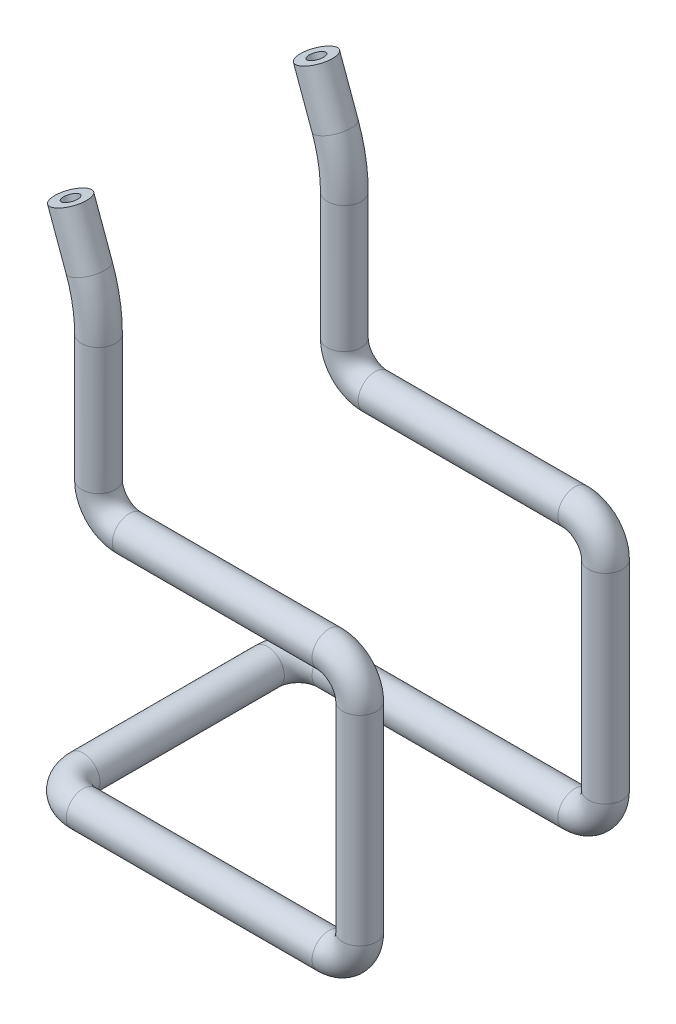
ISO-10303-21;
HEADER;
FILE_DESCRIPTION(('STEP AP214'),'2;1');
FILE_NAME('part.step','',(''),(''),'','','');
FILE_SCHEMA(('AUTOMOTIVE_DESIGN { 1 0 10303 214 1 1 1 1 }'));
ENDSEC;
DATA;
#1=APPLICATION_CONTEXT('core data for automotive mechanical design processes');
#2=APPLICATION_PROTOCOL_DEFINITION('international standard','automotive_design',2000,#1);
#3=PRODUCT_CONTEXT('',#1,'mechanical');
#4=PRODUCT('Part','Part','',(#3));
#5=PRODUCT_RELATED_PRODUCT_CATEGORY('part','',(#4));
#6=PRODUCT_DEFINITION_FORMATION('','',#4);
#7=PRODUCT_DEFINITION_CONTEXT('part definition',#1,'design');
#8=PRODUCT_DEFINITION('design','',#6,#7);
#9=PRODUCT_DEFINITION_SHAPE('','',#8);
#10=(LENGTH_UNIT() NAMED_UNIT(*) SI_UNIT(.MILLI.,.METRE.));
#11=(NAMED_UNIT(*) PLANE_ANGLE_UNIT() SI_UNIT($,.RADIAN.));
#12=(NAMED_UNIT(*) SI_UNIT($,.STERADIAN.) SOLID_ANGLE_UNIT());
#13=UNCERTAINTY_MEASURE_WITH_UNIT(LENGTH_MEASURE(1.E-05),#10,'distance_accuracy_value','');
#14=(GEOMETRIC_REPRESENTATION_CONTEXT(3) GLOBAL_UNCERTAINTY_ASSIGNED_CONTEXT((#13)) GLOBAL_UNIT_ASSIGNED_CONTEXT((#10,
#11,#12)) REPRESENTATION_CONTEXT('',''));
#15=CARTESIAN_POINT('',(0.,0.,0.));
#16=DIRECTION('',(0.,0.,1.));
#17=DIRECTION('',(1.,0.,0.));
#18=AXIS2_PLACEMENT_3D('',#15,#16,#17);
#19=CARTESIAN_POINT('',(5.93646620186974,169.896316525798,-40.));
#20=DIRECTION('',(0.34202014332567,-0.939692620785908,0.));
#21=DIRECTION('',(0.939692620785908,0.34202014332567,0.));
#22=AXIS2_PLACEMENT_3D('',#19,#20,#21);
#23=PLANE('',#22);
#24=CARTESIAN_POINT('',(5.93646620186974,169.896316525798,-40.));
#25=DIRECTION('',(0.34202014332567,-0.939692620785908,0.));
#26=DIRECTION('',(0.939692620785908,0.34202014332567,0.));
#27=AXIS2_PLACEMENT_3D('',#24,#25,#26);
#28=CIRCLE('',#27,2.5);
#29=CARTESIAN_POINT('',(8.28569775383451,170.751366884112,-40.));
#30=VERTEX_POINT('',#29);
#31=EDGE_CURVE('E96',#30,#30,#28,.T.);
#32=ORIENTED_EDGE('',*,*,#31,.T.);
#33=EDGE_LOOP('',(#32));
#34=FACE_BOUND('',#33,.T.);
#35=CARTESIAN_POINT('',(5.93646620186975,169.896316525798,-40.));
#36=DIRECTION('',(0.34202014332567,-0.939692620785908,0.));
#37=DIRECTION('',(0.939692620785908,0.34202014332567,0.));
#38=AXIS2_PLACEMENT_3D('',#35,#36,#37);
#39=CIRCLE('',#38,5.5);
#40=CARTESIAN_POINT('',(11.1047756161922,171.777427314089,-40.));
#41=VERTEX_POINT('',#40);
#42=EDGE_CURVE('E11',#41,#41,#39,.T.);
#43=ORIENTED_EDGE('',*,*,#42,.F.);
#44=EDGE_LOOP('',(#43));
#45=FACE_BOUND('',#44,.T.);
#46=ADVANCED_FACE('F55',(#34,#45),#23,.F.);
#47=CARTESIAN_POINT('',(0.,0.,0.));
#48=DIRECTION('',(0.,0.,-1.));
#49=DIRECTION('',(-1.,0.,0.));
#50=AXIS2_PLACEMENT_3D('',#47,#48,#49);
#51=CYLINDRICAL_SURFACE('',#50,5.5);
#52=CARTESIAN_POINT('',(0.,0.,-30.));
#53=DIRECTION('',(0.,0.,-1.));
#54=DIRECTION('',(-1.,0.,0.));
#55=AXIS2_PLACEMENT_3D('',#52,#53,#54);
#56=CIRCLE('',#55,5.5);
#57=CARTESIAN_POINT('',(-5.5,0.,-30.));
#58=VERTEX_POINT('',#57);
#59=EDGE_CURVE('E93',#58,#58,#56,.F.);
#60=ORIENTED_EDGE('',*,*,#59,.T.);
#61=EDGE_LOOP('',(#60));
#62=FACE_BOUND('',#61,.T.);
#63=CARTESIAN_POINT('',(0.,0.,30.));
#64=DIRECTION('',(0.,0.,1.));
#65=DIRECTION('',(1.,0.,0.));
#66=AXIS2_PLACEMENT_3D('',#63,#64,#65);
#67=CIRCLE('',#66,5.5);
#68=CARTESIAN_POINT('',(-5.5,0.,30.));
#69=VERTEX_POINT('',#68);
#70=EDGE_CURVE('E159',#69,#69,#67,.F.);
#71=ORIENTED_EDGE('',*,*,#70,.T.);
#72=EDGE_LOOP('',(#71));
#73=FACE_BOUND('',#72,.T.);
#74=ADVANCED_FACE('F428',(#62,#73),#51,.T.);
#75=CARTESIAN_POINT('',(10.,0.,-30.));
#76=DIRECTION('',(0.,-1.,0.));
#77=DIRECTION('',(1.,0.,0.));
#78=AXIS2_PLACEMENT_3D('',#75,#76,#77);
#79=TOROIDAL_SURFACE('',#78,10.,5.5);
#80=CARTESIAN_POINT('',(10.0000000000001,0.,-40.));
#81=DIRECTION('',(-1.,0.,0.));
#82=DIRECTION('',(0.,0.,1.));
#83=AXIS2_PLACEMENT_3D('',#80,#81,#82);
#84=CIRCLE('',#83,5.5);
#85=CARTESIAN_POINT('',(10.0000000000001,0.,-45.5));
#86=VERTEX_POINT('',#85);
#87=EDGE_CURVE('E90',#86,#86,#84,.T.);
#88=CARTESIAN_POINT('',(10.,0.,-30.));
#89=DIRECTION('',(0.,-1.,0.));
#90=DIRECTION('',(1.,0.,0.));
#91=AXIS2_PLACEMENT_3D('',#88,#89,#90);
#92=CIRCLE('',#91,15.5);
#93=EDGE_CURVE('',#58,#86,#92,.T.);
#94=ORIENTED_EDGE('',*,*,#59,.F.);
#95=ORIENTED_EDGE('',*,*,#87,.T.);
#96=ORIENTED_EDGE('',*,*,#93,.T.);
#97=ORIENTED_EDGE('',*,*,#93,.F.);
#98=EDGE_LOOP('',(#94,#96,#95,#97));
#99=FACE_BOUND('',#98,.T.);
#100=ADVANCED_FACE('F434',(#99),#79,.T.);
#101=CARTESIAN_POINT('',(10.0000000000001,0.,-40.));
#102=DIRECTION('',(1.,0.,0.));
#103=DIRECTION('',(0.,1.,0.));
#104=AXIS2_PLACEMENT_3D('',#101,#102,#103);
#105=CYLINDRICAL_SURFACE('',#104,5.5);
#106=CARTESIAN_POINT('',(90.0000000000001,0.,-40.));
#107=DIRECTION('',(1.,0.,0.));
#108=DIRECTION('',(0.,1.,0.));
#109=AXIS2_PLACEMENT_3D('',#106,#107,#108);
#110=CIRCLE('',#109,5.5);
#111=CARTESIAN_POINT('',(90.0000000000001,-5.50000000000003,-40.));
#112=VERTEX_POINT('',#111);
#113=EDGE_CURVE('E87',#112,#112,#110,.F.);
#114=ORIENTED_EDGE('',*,*,#113,.T.);
#115=EDGE_LOOP('',(#114));
#116=FACE_BOUND('',#115,.T.);
#117=ORIENTED_EDGE('',*,*,#87,.F.);
#118=EDGE_LOOP('',(#117));
#119=FACE_BOUND('',#118,.T.);
#120=ADVANCED_FACE('F593',(#116,#119),#105,.T.);
#121=CARTESIAN_POINT('',(90.,9.99999999999996,-40.));
#122=DIRECTION('',(0.,0.,1.));
#123=DIRECTION('',(1.,0.,0.));
#124=AXIS2_PLACEMENT_3D('',#121,#122,#123);
#125=TOROIDAL_SURFACE('',#124,9.99999999999999,5.5);
#126=CARTESIAN_POINT('',(100.,9.99999999999999,-40.));
#127=DIRECTION('',(0.,-1.,0.));
#128=DIRECTION('',(1.,0.,0.));
#129=AXIS2_PLACEMENT_3D('',#126,#127,#128);
#130=CIRCLE('',#129,5.5);
#131=CARTESIAN_POINT('',(105.5,10.,-40.));
#132=VERTEX_POINT('',#131);
#133=EDGE_CURVE('E84',#132,#132,#130,.T.);
#134=CARTESIAN_POINT('',(90.,9.99999999999996,-40.));
#135=DIRECTION('',(0.,0.,1.));
#136=DIRECTION('',(1.,0.,0.));
#137=AXIS2_PLACEMENT_3D('',#134,#135,#136);
#138=CIRCLE('',#137,15.5);
#139=EDGE_CURVE('',#112,#132,#138,.T.);
#140=ORIENTED_EDGE('',*,*,#113,.F.);
#141=ORIENTED_EDGE('',*,*,#133,.T.);
#142=ORIENTED_EDGE('',*,*,#139,.T.);
#143=ORIENTED_EDGE('',*,*,#139,.F.);
#144=EDGE_LOOP('',(#140,#142,#141,#143));
#145=FACE_BOUND('',#144,.T.);
#146=ADVANCED_FACE('F583',(#145),#125,.T.);
#147=CARTESIAN_POINT('',(100.,9.99999999999998,-40.));
#148=DIRECTION('',(0.,1.,0.));
#149=DIRECTION('',(0.,0.,1.));
#150=AXIS2_PLACEMENT_3D('',#147,#148,#149);
#151=CYLINDRICAL_SURFACE('',#150,5.5);
#152=CARTESIAN_POINT('',(100.,75.,-40.));
#153=DIRECTION('',(0.,1.,0.));
#154=DIRECTION('',(0.,0.,1.));
#155=AXIS2_PLACEMENT_3D('',#152,#153,#154);
#156=CIRCLE('',#155,5.5);
#157=CARTESIAN_POINT('',(105.5,75.,-40.));
#158=VERTEX_POINT('',#157);
#159=EDGE_CURVE('E81',#158,#158,#156,.F.);
#160=ORIENTED_EDGE('',*,*,#159,.T.);
#161=EDGE_LOOP('',(#160));
#162=FACE_BOUND('',#161,.T.);
#163=ORIENTED_EDGE('',*,*,#133,.F.);
#164=EDGE_LOOP('',(#163));
#165=FACE_BOUND('',#164,.T.);
#166=ADVANCED_FACE('F573',(#162,#165),#151,.T.);
#167=CARTESIAN_POINT('',(90.,75.,-40.));
#168=DIRECTION('',(0.,0.,1.));
#169=DIRECTION('',(1.,0.,0.));
#170=AXIS2_PLACEMENT_3D('',#167,#168,#169);
#171=TOROIDAL_SURFACE('',#170,9.99999999999998,5.5);
#172=CARTESIAN_POINT('',(90.,85.,-40.));
#173=DIRECTION('',(1.,0.,0.));
#174=DIRECTION('',(0.,1.,0.));
#175=AXIS2_PLACEMENT_3D('',#172,#173,#174);
#176=CIRCLE('',#175,5.5);
#177=CARTESIAN_POINT('',(89.9999999999999,90.5,-40.));
#178=VERTEX_POINT('',#177);
#179=EDGE_CURVE('E78',#178,#178,#176,.T.);
#180=CARTESIAN_POINT('',(90.,75.,-40.));
#181=DIRECTION('',(0.,0.,1.));
#182=DIRECTION('',(1.,0.,0.));
#183=AXIS2_PLACEMENT_3D('',#180,#181,#182);
#184=CIRCLE('',#183,15.5);
#185=EDGE_CURVE('',#158,#178,#184,.T.);
#186=ORIENTED_EDGE('',*,*,#159,.F.);
#187=ORIENTED_EDGE('',*,*,#179,.T.);
#188=ORIENTED_EDGE('',*,*,#185,.T.);
#189=ORIENTED_EDGE('',*,*,#185,.F.);
#190=EDGE_LOOP('',(#186,#188,#187,#189));
#191=FACE_BOUND('',#190,.T.);
#192=ADVANCED_FACE('F563',(#191),#171,.T.);
#193=CARTESIAN_POINT('',(90.,85.,-40.));
#194=DIRECTION('',(-1.,0.,0.));
#195=DIRECTION('',(0.,0.,1.));
#196=AXIS2_PLACEMENT_3D('',#193,#194,#195);
#197=CYLINDRICAL_SURFACE('',#196,5.5);
#198=CARTESIAN_POINT('',(25.,85.,-40.));
#199=DIRECTION('',(-1.,0.,0.));
#200=DIRECTION('',(0.,0.,1.));
#201=AXIS2_PLACEMENT_3D('',#198,#199,#200);
#202=CIRCLE('',#201,5.5);
#203=CARTESIAN_POINT('',(25.,79.4999999999999,-40.));
#204=VERTEX_POINT('',#203);
#205=EDGE_CURVE('E75',#204,#204,#202,.F.);
#206=ORIENTED_EDGE('',*,*,#205,.T.);
#207=EDGE_LOOP('',(#206));
#208=FACE_BOUND('',#207,.T.);
#209=ORIENTED_EDGE('',*,*,#179,.F.);
#210=EDGE_LOOP('',(#209));
#211=FACE_BOUND('',#210,.T.);
#212=ADVANCED_FACE('F553',(#208,#211),#197,.T.);
#213=CARTESIAN_POINT('',(25.,95.,-40.));
#214=DIRECTION('',(0.,0.,-1.));
#215=DIRECTION('',(-1.,0.,0.));
#216=AXIS2_PLACEMENT_3D('',#213,#214,#215);
#217=TOROIDAL_SURFACE('',#216,10.,5.5);
#218=CARTESIAN_POINT('',(15.,95.,-40.));
#219=DIRECTION('',(0.,-1.,0.));
#220=DIRECTION('',(1.,0.,0.));
#221=AXIS2_PLACEMENT_3D('',#218,#219,#220);
#222=CIRCLE('',#221,5.5);
#223=CARTESIAN_POINT('',(9.49999999999998,95.,-40.));
#224=VERTEX_POINT('',#223);
#225=EDGE_CURVE('E70',#224,#224,#222,.T.);
#226=CARTESIAN_POINT('',(25.,95.,-40.));
#227=DIRECTION('',(0.,0.,-1.));
#228=DIRECTION('',(-1.,0.,0.));
#229=AXIS2_PLACEMENT_3D('',#226,#227,#228);
#230=CIRCLE('',#229,15.5);
#231=EDGE_CURVE('',#204,#224,#230,.T.);
#232=ORIENTED_EDGE('',*,*,#205,.F.);
#233=ORIENTED_EDGE('',*,*,#225,.T.);
#234=ORIENTED_EDGE('',*,*,#231,.T.);
#235=ORIENTED_EDGE('',*,*,#231,.F.);
#236=EDGE_LOOP('',(#232,#234,#233,#235));
#237=FACE_BOUND('',#236,.T.);
#238=ADVANCED_FACE('F543',(#237),#217,.T.);
#239=CARTESIAN_POINT('',(15.,95.,-40.));
#240=DIRECTION('',(0.,1.,0.));
#241=DIRECTION('',(-1.,0.,0.));
#242=AXIS2_PLACEMENT_3D('',#239,#240,#241);
#243=CYLINDRICAL_SURFACE('',#242,5.5);
#244=CARTESIAN_POINT('',(15.,136.178113039548,-40.));
#245=DIRECTION('',(0.,1.,0.));
#246=DIRECTION('',(-1.,0.,0.));
#247=AXIS2_PLACEMENT_3D('',#244,#245,#246);
#248=CIRCLE('',#247,5.5);
#249=CARTESIAN_POINT('',(20.5,136.178113039548,-40.));
#250=VERTEX_POINT('',#249);
#251=EDGE_CURVE('E66',#250,#250,#248,.F.);
#252=ORIENTED_EDGE('',*,*,#251,.T.);
#253=EDGE_LOOP('',(#252));
#254=FACE_BOUND('',#253,.T.);
#255=ORIENTED_EDGE('',*,*,#225,.F.);
#256=EDGE_LOOP('',(#255));
#257=FACE_BOUND('',#256,.T.);
#258=ADVANCED_FACE('F535',(#254,#257),#243,.T.);
#259=CARTESIAN_POINT('',(-35.,136.178113039548,-40.));
#260=DIRECTION('',(0.,0.,1.));
#261=DIRECTION('',(1.,0.,0.));
#262=AXIS2_PLACEMENT_3D('',#259,#260,#261);
#263=TOROIDAL_SURFACE('',#262,50.,5.5);
#264=CARTESIAN_POINT('',(11.9846310392954,153.279120205831,-40.));
#265=DIRECTION('',(0.342020143325671,-0.939692620785908,0.));
#266=DIRECTION('',(0.939692620785908,0.342020143325671,0.));
#267=AXIS2_PLACEMENT_3D('',#264,#265,#266);
#268=CIRCLE('',#267,5.5);
#269=CARTESIAN_POINT('',(17.1529404536179,155.160230994123,-40.));
#270=VERTEX_POINT('',#269);
#271=EDGE_CURVE('E62',#270,#270,#268,.T.);
#272=CARTESIAN_POINT('',(-35.,136.178113039548,-40.));
#273=DIRECTION('',(0.,0.,1.));
#274=DIRECTION('',(1.,0.,0.));
#275=AXIS2_PLACEMENT_3D('',#272,#273,#274);
#276=CIRCLE('',#275,55.5);
#277=EDGE_CURVE('',#250,#270,#276,.T.);
#278=ORIENTED_EDGE('',*,*,#251,.F.);
#279=ORIENTED_EDGE('',*,*,#271,.T.);
#280=ORIENTED_EDGE('',*,*,#277,.T.);
#281=ORIENTED_EDGE('',*,*,#277,.F.);
#282=EDGE_LOOP('',(#278,#280,#279,#281));
#283=FACE_BOUND('',#282,.T.);
#284=ADVANCED_FACE('F211',(#283),#263,.T.);
#285=CARTESIAN_POINT('',(11.9846310392954,153.279120205831,-40.));
#286=DIRECTION('',(-0.34202014332567,0.939692620785908,0.));
#287=DIRECTION('',(-0.939692620785908,-0.34202014332567,0.));
#288=AXIS2_PLACEMENT_3D('',#285,#286,#287);
#289=CYLINDRICAL_SURFACE('',#288,5.5);
#290=ORIENTED_EDGE('',*,*,#42,.T.);
#291=EDGE_LOOP('',(#290));
#292=FACE_BOUND('',#291,.T.);
#293=ORIENTED_EDGE('',*,*,#271,.F.);
#294=EDGE_LOOP('',(#293));
#295=FACE_BOUND('',#294,.T.);
#296=ADVANCED_FACE('F57',(#292,#295),#289,.T.);
#297=CARTESIAN_POINT('',(0.,0.,0.));
#298=DIRECTION('',(0.,0.,-1.));
#299=DIRECTION('',(-1.,0.,0.));
#300=AXIS2_PLACEMENT_3D('',#297,#298,#299);
#301=CYLINDRICAL_SURFACE('',#300,2.5);
#302=CARTESIAN_POINT('',(0.,0.,-30.));
#303=DIRECTION('',(0.,0.,1.));
#304=DIRECTION('',(0.,-1.,0.));
#305=AXIS2_PLACEMENT_3D('',#302,#303,#304);
#306=CIRCLE('',#305,2.5);
#307=CARTESIAN_POINT('',(-2.5,0.,-30.));
#308=VERTEX_POINT('',#307);
#309=EDGE_CURVE('E126',#308,#308,#306,.T.);
#310=ORIENTED_EDGE('',*,*,#309,.F.);
#311=EDGE_LOOP('',(#310));
#312=FACE_BOUND('',#311,.T.);
#313=CARTESIAN_POINT('',(0.,0.,30.));
#314=DIRECTION('',(0.,0.,1.));
#315=DIRECTION('',(0.,-1.,0.));
#316=AXIS2_PLACEMENT_3D('',#313,#314,#315);
#317=CIRCLE('',#316,2.5);
#318=CARTESIAN_POINT('',(-2.5,0.,30.));
#319=VERTEX_POINT('',#318);
#320=EDGE_CURVE('E192',#319,#319,#317,.F.);
#321=ORIENTED_EDGE('',*,*,#320,.F.);
#322=EDGE_LOOP('',(#321));
#323=FACE_BOUND('',#322,.T.);
#324=ADVANCED_FACE('F198',(#312,#323),#301,.F.);
#325=CARTESIAN_POINT('',(10.,0.,-30.));
#326=DIRECTION('',(0.,-1.,0.));
#327=DIRECTION('',(1.,0.,0.));
#328=AXIS2_PLACEMENT_3D('',#325,#326,#327);
#329=TOROIDAL_SURFACE('',#328,10.,2.5);
#330=CARTESIAN_POINT('',(10.0000000000001,0.,-40.));
#331=DIRECTION('',(-1.,0.,0.));
#332=DIRECTION('',(0.,-1.,0.));
#333=AXIS2_PLACEMENT_3D('',#330,#331,#332);
#334=CIRCLE('',#333,2.5);
#335=CARTESIAN_POINT('',(10.0000000000001,0.,-42.5));
#336=VERTEX_POINT('',#335);
#337=EDGE_CURVE('E123',#336,#336,#334,.T.);
#338=CARTESIAN_POINT('',(10.,0.,-30.));
#339=DIRECTION('',(0.,-1.,0.));
#340=DIRECTION('',(1.,0.,0.));
#341=AXIS2_PLACEMENT_3D('',#338,#339,#340);
#342=CIRCLE('',#341,12.5);
#343=EDGE_CURVE('',#308,#336,#342,.T.);
#344=ORIENTED_EDGE('',*,*,#309,.T.);
#345=ORIENTED_EDGE('',*,*,#337,.F.);
#346=ORIENTED_EDGE('',*,*,#343,.T.);
#347=ORIENTED_EDGE('',*,*,#343,.F.);
#348=EDGE_LOOP('',(#344,#346,#345,#347));
#349=FACE_BOUND('',#348,.T.);
#350=ADVANCED_FACE('F200',(#349),#329,.F.);
#351=CARTESIAN_POINT('',(10.0000000000001,0.,-40.));
#352=DIRECTION('',(1.,0.,0.));
#353=DIRECTION('',(0.,1.,0.));
#354=AXIS2_PLACEMENT_3D('',#351,#352,#353);
#355=CYLINDRICAL_SURFACE('',#354,2.5);
#356=CARTESIAN_POINT('',(90.0000000000001,0.,-40.));
#357=DIRECTION('',(-1.,0.,0.));
#358=DIRECTION('',(0.,-1.,0.));
#359=AXIS2_PLACEMENT_3D('',#356,#357,#358);
#360=CIRCLE('',#359,2.5);
#361=CARTESIAN_POINT('',(90.0000000000001,-2.50000000000003,-40.));
#362=VERTEX_POINT('',#361);
#363=EDGE_CURVE('E120',#362,#362,#360,.T.);
#364=ORIENTED_EDGE('',*,*,#363,.F.);
#365=EDGE_LOOP('',(#364));
#366=FACE_BOUND('',#365,.T.);
#367=ORIENTED_EDGE('',*,*,#337,.T.);
#368=EDGE_LOOP('',(#367));
#369=FACE_BOUND('',#368,.T.);
#370=ADVANCED_FACE('F208',(#366,#369),#355,.F.);
#371=CARTESIAN_POINT('',(90.,9.99999999999996,-40.));
#372=DIRECTION('',(0.,0.,1.));
#373=DIRECTION('',(1.,0.,0.));
#374=AXIS2_PLACEMENT_3D('',#371,#372,#373);
#375=TOROIDAL_SURFACE('',#374,9.99999999999999,2.5);
#376=CARTESIAN_POINT('',(100.,9.99999999999998,-40.));
#377=DIRECTION('',(0.,-1.,0.));
#378=DIRECTION('',(1.,0.,0.));
#379=AXIS2_PLACEMENT_3D('',#376,#377,#378);
#380=CIRCLE('',#379,2.5);
#381=CARTESIAN_POINT('',(102.5,9.99999999999999,-40.));
#382=VERTEX_POINT('',#381);
#383=EDGE_CURVE('E117',#382,#382,#380,.T.);
#384=CARTESIAN_POINT('',(90.,9.99999999999996,-40.));
#385=DIRECTION('',(0.,0.,1.));
#386=DIRECTION('',(1.,0.,0.));
#387=AXIS2_PLACEMENT_3D('',#384,#385,#386);
#388=CIRCLE('',#387,12.5);
#389=EDGE_CURVE('',#362,#382,#388,.T.);
#390=ORIENTED_EDGE('',*,*,#363,.T.);
#391=ORIENTED_EDGE('',*,*,#383,.F.);
#392=ORIENTED_EDGE('',*,*,#389,.T.);
#393=ORIENTED_EDGE('',*,*,#389,.F.);
#394=EDGE_LOOP('',(#390,#392,#391,#393));
#395=FACE_BOUND('',#394,.T.);
#396=ADVANCED_FACE('F501',(#395),#375,.F.);
#397=CARTESIAN_POINT('',(100.,9.99999999999998,-40.));
#398=DIRECTION('',(0.,1.,0.));
#399=DIRECTION('',(0.,0.,1.));
#400=AXIS2_PLACEMENT_3D('',#397,#398,#399);
#401=CYLINDRICAL_SURFACE('',#400,2.5);
#402=CARTESIAN_POINT('',(100.,75.,-40.));
#403=DIRECTION('',(0.,-1.,0.));
#404=DIRECTION('',(1.,0.,0.));
#405=AXIS2_PLACEMENT_3D('',#402,#403,#404);
#406=CIRCLE('',#405,2.5);
#407=CARTESIAN_POINT('',(102.5,75.,-40.));
#408=VERTEX_POINT('',#407);
#409=EDGE_CURVE('E114',#408,#408,#406,.T.);
#410=ORIENTED_EDGE('',*,*,#409,.F.);
#411=EDGE_LOOP('',(#410));
#412=FACE_BOUND('',#411,.T.);
#413=ORIENTED_EDGE('',*,*,#383,.T.);
#414=EDGE_LOOP('',(#413));
#415=FACE_BOUND('',#414,.T.);
#416=ADVANCED_FACE('F492',(#412,#415),#401,.F.);
#417=CARTESIAN_POINT('',(90.,75.,-40.));
#418=DIRECTION('',(0.,0.,1.));
#419=DIRECTION('',(1.,0.,0.));
#420=AXIS2_PLACEMENT_3D('',#417,#418,#419);
#421=TOROIDAL_SURFACE('',#420,9.99999999999998,2.5);
#422=CARTESIAN_POINT('',(90.,85.,-40.));
#423=DIRECTION('',(1.,0.,0.));
#424=DIRECTION('',(0.,1.,0.));
#425=AXIS2_PLACEMENT_3D('',#422,#423,#424);
#426=CIRCLE('',#425,2.5);
#427=CARTESIAN_POINT('',(90.,87.5,-40.));
#428=VERTEX_POINT('',#427);
#429=EDGE_CURVE('E111',#428,#428,#426,.T.);
#430=CARTESIAN_POINT('',(90.,75.,-40.));
#431=DIRECTION('',(0.,0.,1.));
#432=DIRECTION('',(1.,0.,0.));
#433=AXIS2_PLACEMENT_3D('',#430,#431,#432);
#434=CIRCLE('',#433,12.5);
#435=EDGE_CURVE('',#408,#428,#434,.T.);
#436=ORIENTED_EDGE('',*,*,#409,.T.);
#437=ORIENTED_EDGE('',*,*,#429,.F.);
#438=ORIENTED_EDGE('',*,*,#435,.T.);
#439=ORIENTED_EDGE('',*,*,#435,.F.);
#440=EDGE_LOOP('',(#436,#438,#437,#439));
#441=FACE_BOUND('',#440,.T.);
#442=ADVANCED_FACE('F483',(#441),#421,.F.);
#443=CARTESIAN_POINT('',(90.,85.,-40.));
#444=DIRECTION('',(-1.,0.,0.));
#445=DIRECTION('',(0.,0.,1.));
#446=AXIS2_PLACEMENT_3D('',#443,#444,#445);
#447=CYLINDRICAL_SURFACE('',#446,2.5);
#448=CARTESIAN_POINT('',(25.,85.,-40.));
#449=DIRECTION('',(1.,0.,0.));
#450=DIRECTION('',(0.,1.,0.));
#451=AXIS2_PLACEMENT_3D('',#448,#449,#450);
#452=CIRCLE('',#451,2.5);
#453=CARTESIAN_POINT('',(25.,82.4999999999999,-40.));
#454=VERTEX_POINT('',#453);
#455=EDGE_CURVE('E108',#454,#454,#452,.T.);
#456=ORIENTED_EDGE('',*,*,#455,.F.);
#457=EDGE_LOOP('',(#456));
#458=FACE_BOUND('',#457,.T.);
#459=ORIENTED_EDGE('',*,*,#429,.T.);
#460=EDGE_LOOP('',(#459));
#461=FACE_BOUND('',#460,.T.);
#462=ADVANCED_FACE('F474',(#458,#461),#447,.F.);
#463=CARTESIAN_POINT('',(25.,95.,-40.));
#464=DIRECTION('',(0.,0.,-1.));
#465=DIRECTION('',(-1.,0.,0.));
#466=AXIS2_PLACEMENT_3D('',#463,#464,#465);
#467=TOROIDAL_SURFACE('',#466,10.,2.5);
#468=CARTESIAN_POINT('',(15.,95.,-40.));
#469=DIRECTION('',(0.,-1.,0.));
#470=DIRECTION('',(1.,0.,0.));
#471=AXIS2_PLACEMENT_3D('',#468,#469,#470);
#472=CIRCLE('',#471,2.5);
#473=CARTESIAN_POINT('',(12.5,95.,-40.));
#474=VERTEX_POINT('',#473);
#475=EDGE_CURVE('E105',#474,#474,#472,.T.);
#476=CARTESIAN_POINT('',(25.,95.,-40.));
#477=DIRECTION('',(0.,0.,-1.));
#478=DIRECTION('',(-1.,0.,0.));
#479=AXIS2_PLACEMENT_3D('',#476,#477,#478);
#480=CIRCLE('',#479,12.5);
#481=EDGE_CURVE('',#454,#474,#480,.T.);
#482=ORIENTED_EDGE('',*,*,#455,.T.);
#483=ORIENTED_EDGE('',*,*,#475,.F.);
#484=ORIENTED_EDGE('',*,*,#481,.T.);
#485=ORIENTED_EDGE('',*,*,#481,.F.);
#486=EDGE_LOOP('',(#482,#484,#483,#485));
#487=FACE_BOUND('',#486,.T.);
#488=ADVANCED_FACE('F465',(#487),#467,.F.);
#489=CARTESIAN_POINT('',(15.,95.,-40.));
#490=DIRECTION('',(0.,1.,0.));
#491=DIRECTION('',(-1.,0.,0.));
#492=AXIS2_PLACEMENT_3D('',#489,#490,#491);
#493=CYLINDRICAL_SURFACE('',#492,2.5);
#494=CARTESIAN_POINT('',(15.,136.178113039548,-40.));
#495=DIRECTION('',(0.,-1.,0.));
#496=DIRECTION('',(1.,0.,0.));
#497=AXIS2_PLACEMENT_3D('',#494,#495,#496);
#498=CIRCLE('',#497,2.5);
#499=CARTESIAN_POINT('',(17.5,136.178113039548,-40.));
#500=VERTEX_POINT('',#499);
#501=EDGE_CURVE('E102',#500,#500,#498,.T.);
#502=ORIENTED_EDGE('',*,*,#501,.F.);
#503=EDGE_LOOP('',(#502));
#504=FACE_BOUND('',#503,.T.);
#505=ORIENTED_EDGE('',*,*,#475,.T.);
#506=EDGE_LOOP('',(#505));
#507=FACE_BOUND('',#506,.T.);
#508=ADVANCED_FACE('F456',(#504,#507),#493,.F.);
#509=CARTESIAN_POINT('',(-35.,136.178113039548,-40.));
#510=DIRECTION('',(0.,0.,1.));
#511=DIRECTION('',(1.,0.,0.));
#512=AXIS2_PLACEMENT_3D('',#509,#510,#511);
#513=TOROIDAL_SURFACE('',#512,50.,2.5);
#514=CARTESIAN_POINT('',(11.9846310392953,153.279120205831,-40.));
#515=DIRECTION('',(0.34202014332567,-0.939692620785908,0.));
#516=DIRECTION('',(0.939692620785908,0.34202014332567,0.));
#517=AXIS2_PLACEMENT_3D('',#514,#515,#516);
#518=CIRCLE('',#517,2.5);
#519=CARTESIAN_POINT('',(14.3338625912601,154.134170564146,-40.));
#520=VERTEX_POINT('',#519);
#521=EDGE_CURVE('E99',#520,#520,#518,.T.);
#522=CARTESIAN_POINT('',(-35.,136.178113039548,-40.));
#523=DIRECTION('',(0.,0.,1.));
#524=DIRECTION('',(1.,0.,0.));
#525=AXIS2_PLACEMENT_3D('',#522,#523,#524);
#526=CIRCLE('',#525,52.5);
#527=EDGE_CURVE('',#500,#520,#526,.T.);
#528=ORIENTED_EDGE('',*,*,#501,.T.);
#529=ORIENTED_EDGE('',*,*,#521,.F.);
#530=ORIENTED_EDGE('',*,*,#527,.T.);
#531=ORIENTED_EDGE('',*,*,#527,.F.);
#532=EDGE_LOOP('',(#528,#530,#529,#531));
#533=FACE_BOUND('',#532,.T.);
#534=ADVANCED_FACE('F447',(#533),#513,.F.);
#535=CARTESIAN_POINT('',(11.9846310392954,153.279120205831,-40.));
#536=DIRECTION('',(-0.34202014332567,0.939692620785908,0.));
#537=DIRECTION('',(-0.939692620785908,-0.34202014332567,0.));
#538=AXIS2_PLACEMENT_3D('',#535,#536,#537);
#539=CYLINDRICAL_SURFACE('',#538,2.5);
#540=ORIENTED_EDGE('',*,*,#31,.F.);
#541=EDGE_LOOP('',(#540));
#542=FACE_BOUND('',#541,.T.);
#543=ORIENTED_EDGE('',*,*,#521,.T.);
#544=EDGE_LOOP('',(#543));
#545=FACE_BOUND('',#544,.T.);
#546=ADVANCED_FACE('F263',(#542,#545),#539,.F.);
#547=CARTESIAN_POINT('',(5.93646620186974,169.896316525798,40.));
#548=DIRECTION('',(0.34202014332567,-0.939692620785908,0.));
#549=DIRECTION('',(0.939692620785908,0.34202014332567,0.));
#550=AXIS2_PLACEMENT_3D('',#547,#548,#549);
#551=PLANE('',#550);
#552=CARTESIAN_POINT('',(5.93646620186974,169.896316525798,40.));
#553=DIRECTION('',(-0.34202014332567,0.939692620785908,0.));
#554=DIRECTION('',(0.939692620785908,0.34202014332567,0.));
#555=AXIS2_PLACEMENT_3D('',#552,#553,#554);
#556=CIRCLE('',#555,2.5);
#557=CARTESIAN_POINT('',(8.28569775383451,170.751366884112,40.));
#558=VERTEX_POINT('',#557);
#559=EDGE_CURVE('E162',#558,#558,#556,.F.);
#560=ORIENTED_EDGE('',*,*,#559,.T.);
#561=EDGE_LOOP('',(#560));
#562=FACE_BOUND('',#561,.T.);
#563=CARTESIAN_POINT('',(5.93646620186975,169.896316525798,40.));
#564=DIRECTION('',(0.34202014332567,-0.939692620785908,0.));
#565=DIRECTION('',(0.939692620785908,0.34202014332567,0.));
#566=AXIS2_PLACEMENT_3D('',#563,#564,#565);
#567=CIRCLE('',#566,5.5);
#568=CARTESIAN_POINT('',(11.1047756161922,171.777427314089,40.));
#569=VERTEX_POINT('',#568);
#570=EDGE_CURVE('E129',#569,#569,#567,.T.);
#571=ORIENTED_EDGE('',*,*,#570,.F.);
#572=EDGE_LOOP('',(#571));
#573=FACE_BOUND('',#572,.T.);
#574=ADVANCED_FACE('F259',(#562,#573),#551,.F.);
#575=CARTESIAN_POINT('',(10.,0.,30.));
#576=DIRECTION('',(0.,1.,0.));
#577=DIRECTION('',(-1.,0.,0.));
#578=AXIS2_PLACEMENT_3D('',#575,#576,#577);
#579=TOROIDAL_SURFACE('',#578,10.,5.5);
#580=CARTESIAN_POINT('',(10.0000000000001,0.,40.));
#581=DIRECTION('',(-1.,0.,0.));
#582=DIRECTION('',(0.,0.,1.));
#583=AXIS2_PLACEMENT_3D('',#580,#581,#582);
#584=CIRCLE('',#583,5.5);
#585=CARTESIAN_POINT('',(10.0000000000001,0.,45.5));
#586=VERTEX_POINT('',#585);
#587=EDGE_CURVE('E156',#586,#586,#584,.T.);
#588=CARTESIAN_POINT('',(10.,0.,30.));
#589=DIRECTION('',(0.,1.,0.));
#590=DIRECTION('',(-1.,0.,0.));
#591=AXIS2_PLACEMENT_3D('',#588,#589,#590);
#592=CIRCLE('',#591,15.5);
#593=EDGE_CURVE('',#69,#586,#592,.T.);
#594=ORIENTED_EDGE('',*,*,#70,.F.);
#595=ORIENTED_EDGE('',*,*,#587,.T.);
#596=ORIENTED_EDGE('',*,*,#593,.T.);
#597=ORIENTED_EDGE('',*,*,#593,.F.);
#598=EDGE_LOOP('',(#594,#596,#595,#597));
#599=FACE_BOUND('',#598,.T.);
#600=ADVANCED_FACE('F255',(#599),#579,.T.);
#601=CARTESIAN_POINT('',(10.0000000000001,0.,40.));
#602=DIRECTION('',(1.,0.,0.));
#603=DIRECTION('',(0.,1.,0.));
#604=AXIS2_PLACEMENT_3D('',#601,#602,#603);
#605=CYLINDRICAL_SURFACE('',#604,5.5);
#606=CARTESIAN_POINT('',(90.0000000000001,0.,40.));
#607=DIRECTION('',(1.,0.,0.));
#608=DIRECTION('',(0.,1.,0.));
#609=AXIS2_PLACEMENT_3D('',#606,#607,#608);
#610=CIRCLE('',#609,5.5);
#611=CARTESIAN_POINT('',(90.0000000000001,-5.50000000000003,40.));
#612=VERTEX_POINT('',#611);
#613=EDGE_CURVE('E153',#612,#612,#610,.F.);
#614=ORIENTED_EDGE('',*,*,#613,.T.);
#615=EDGE_LOOP('',(#614));
#616=FACE_BOUND('',#615,.T.);
#617=ORIENTED_EDGE('',*,*,#587,.F.);
#618=EDGE_LOOP('',(#617));
#619=FACE_BOUND('',#618,.T.);
#620=ADVANCED_FACE('F251',(#616,#619),#605,.T.);
#621=CARTESIAN_POINT('',(90.,9.99999999999996,40.));
#622=DIRECTION('',(0.,0.,1.));
#623=DIRECTION('',(1.,0.,0.));
#624=AXIS2_PLACEMENT_3D('',#621,#622,#623);
#625=TOROIDAL_SURFACE('',#624,9.99999999999999,5.5);
#626=CARTESIAN_POINT('',(100.,9.99999999999999,40.));
#627=DIRECTION('',(0.,-1.,0.));
#628=DIRECTION('',(1.,0.,0.));
#629=AXIS2_PLACEMENT_3D('',#626,#627,#628);
#630=CIRCLE('',#629,5.5);
#631=CARTESIAN_POINT('',(105.5,10.,40.));
#632=VERTEX_POINT('',#631);
#633=EDGE_CURVE('E150',#632,#632,#630,.T.);
#634=CARTESIAN_POINT('',(90.,9.99999999999996,40.));
#635=DIRECTION('',(0.,0.,1.));
#636=DIRECTION('',(1.,0.,0.));
#637=AXIS2_PLACEMENT_3D('',#634,#635,#636);
#638=CIRCLE('',#637,15.5);
#639=EDGE_CURVE('',#612,#632,#638,.T.);
#640=ORIENTED_EDGE('',*,*,#613,.F.);
#641=ORIENTED_EDGE('',*,*,#633,.T.);
#642=ORIENTED_EDGE('',*,*,#639,.T.);
#643=ORIENTED_EDGE('',*,*,#639,.F.);
#644=EDGE_LOOP('',(#640,#642,#641,#643));
#645=FACE_BOUND('',#644,.T.);
#646=ADVANCED_FACE('F247',(#645),#625,.T.);
#647=CARTESIAN_POINT('',(100.,9.99999999999998,40.));
#648=DIRECTION('',(0.,1.,0.));
#649=DIRECTION('',(0.,0.,1.));
#650=AXIS2_PLACEMENT_3D('',#647,#648,#649);
#651=CYLINDRICAL_SURFACE('',#650,5.5);
#652=CARTESIAN_POINT('',(100.,75.,40.));
#653=DIRECTION('',(0.,1.,0.));
#654=DIRECTION('',(0.,0.,1.));
#655=AXIS2_PLACEMENT_3D('',#652,#653,#654);
#656=CIRCLE('',#655,5.5);
#657=CARTESIAN_POINT('',(105.5,75.,40.));
#658=VERTEX_POINT('',#657);
#659=EDGE_CURVE('E147',#658,#658,#656,.F.);
#660=ORIENTED_EDGE('',*,*,#659,.T.);
#661=EDGE_LOOP('',(#660));
#662=FACE_BOUND('',#661,.T.);
#663=ORIENTED_EDGE('',*,*,#633,.F.);
#664=EDGE_LOOP('',(#663));
#665=FACE_BOUND('',#664,.T.);
#666=ADVANCED_FACE('F243',(#662,#665),#651,.T.);
#667=CARTESIAN_POINT('',(90.,75.,40.));
#668=DIRECTION('',(0.,0.,1.));
#669=DIRECTION('',(1.,0.,0.));
#670=AXIS2_PLACEMENT_3D('',#667,#668,#669);
#671=TOROIDAL_SURFACE('',#670,9.99999999999998,5.5);
#672=CARTESIAN_POINT('',(90.,85.,40.));
#673=DIRECTION('',(1.,0.,0.));
#674=DIRECTION('',(0.,1.,0.));
#675=AXIS2_PLACEMENT_3D('',#672,#673,#674);
#676=CIRCLE('',#675,5.5);
#677=CARTESIAN_POINT('',(89.9999999999999,90.5,40.));
#678=VERTEX_POINT('',#677);
#679=EDGE_CURVE('E144',#678,#678,#676,.T.);
#680=CARTESIAN_POINT('',(90.,75.,40.));
#681=DIRECTION('',(0.,0.,1.));
#682=DIRECTION('',(1.,0.,0.));
#683=AXIS2_PLACEMENT_3D('',#680,#681,#682);
#684=CIRCLE('',#683,15.5);
#685=EDGE_CURVE('',#658,#678,#684,.T.);
#686=ORIENTED_EDGE('',*,*,#659,.F.);
#687=ORIENTED_EDGE('',*,*,#679,.T.);
#688=ORIENTED_EDGE('',*,*,#685,.T.);
#689=ORIENTED_EDGE('',*,*,#685,.F.);
#690=EDGE_LOOP('',(#686,#688,#687,#689));
#691=FACE_BOUND('',#690,.T.);
#692=ADVANCED_FACE('F239',(#691),#671,.T.);
#693=CARTESIAN_POINT('',(90.,85.,40.));
#694=DIRECTION('',(-1.,0.,0.));
#695=DIRECTION('',(0.,0.,1.));
#696=AXIS2_PLACEMENT_3D('',#693,#694,#695);
#697=CYLINDRICAL_SURFACE('',#696,5.5);
#698=CARTESIAN_POINT('',(25.,85.,40.));
#699=DIRECTION('',(-1.,0.,0.));
#700=DIRECTION('',(0.,0.,1.));
#701=AXIS2_PLACEMENT_3D('',#698,#699,#700);
#702=CIRCLE('',#701,5.5);
#703=CARTESIAN_POINT('',(25.,79.4999999999999,40.));
#704=VERTEX_POINT('',#703);
#705=EDGE_CURVE('E141',#704,#704,#702,.F.);
#706=ORIENTED_EDGE('',*,*,#705,.T.);
#707=EDGE_LOOP('',(#706));
#708=FACE_BOUND('',#707,.T.);
#709=ORIENTED_EDGE('',*,*,#679,.F.);
#710=EDGE_LOOP('',(#709));
#711=FACE_BOUND('',#710,.T.);
#712=ADVANCED_FACE('F235',(#708,#711),#697,.T.);
#713=CARTESIAN_POINT('',(25.,95.,40.));
#714=DIRECTION('',(0.,0.,-1.));
#715=DIRECTION('',(-1.,0.,0.));
#716=AXIS2_PLACEMENT_3D('',#713,#714,#715);
#717=TOROIDAL_SURFACE('',#716,10.,5.5);
#718=CARTESIAN_POINT('',(15.,95.,40.));
#719=DIRECTION('',(0.,-1.,0.));
#720=DIRECTION('',(1.,0.,0.));
#721=AXIS2_PLACEMENT_3D('',#718,#719,#720);
#722=CIRCLE('',#721,5.5);
#723=CARTESIAN_POINT('',(9.49999999999998,95.,40.));
#724=VERTEX_POINT('',#723);
#725=EDGE_CURVE('E138',#724,#724,#722,.T.);
#726=CARTESIAN_POINT('',(25.,95.,40.));
#727=DIRECTION('',(0.,0.,-1.));
#728=DIRECTION('',(-1.,0.,0.));
#729=AXIS2_PLACEMENT_3D('',#726,#727,#728);
#730=CIRCLE('',#729,15.5);
#731=EDGE_CURVE('',#704,#724,#730,.T.);
#732=ORIENTED_EDGE('',*,*,#705,.F.);
#733=ORIENTED_EDGE('',*,*,#725,.T.);
#734=ORIENTED_EDGE('',*,*,#731,.T.);
#735=ORIENTED_EDGE('',*,*,#731,.F.);
#736=EDGE_LOOP('',(#732,#734,#733,#735));
#737=FACE_BOUND('',#736,.T.);
#738=ADVANCED_FACE('F231',(#737),#717,.T.);
#739=CARTESIAN_POINT('',(15.,95.,40.));
#740=DIRECTION('',(0.,1.,0.));
#741=DIRECTION('',(-1.,0.,0.));
#742=AXIS2_PLACEMENT_3D('',#739,#740,#741);
#743=CYLINDRICAL_SURFACE('',#742,5.5);
#744=CARTESIAN_POINT('',(15.,136.178113039548,40.));
#745=DIRECTION('',(0.,1.,0.));
#746=DIRECTION('',(-1.,0.,0.));
#747=AXIS2_PLACEMENT_3D('',#744,#745,#746);
#748=CIRCLE('',#747,5.5);
#749=CARTESIAN_POINT('',(20.5,136.178113039548,40.));
#750=VERTEX_POINT('',#749);
#751=EDGE_CURVE('E135',#750,#750,#748,.F.);
#752=ORIENTED_EDGE('',*,*,#751,.T.);
#753=EDGE_LOOP('',(#752));
#754=FACE_BOUND('',#753,.T.);
#755=ORIENTED_EDGE('',*,*,#725,.F.);
#756=EDGE_LOOP('',(#755));
#757=FACE_BOUND('',#756,.T.);
#758=ADVANCED_FACE('F224',(#754,#757),#743,.T.);
#759=CARTESIAN_POINT('',(-35.,136.178113039548,40.));
#760=DIRECTION('',(0.,0.,1.));
#761=DIRECTION('',(1.,0.,0.));
#762=AXIS2_PLACEMENT_3D('',#759,#760,#761);
#763=TOROIDAL_SURFACE('',#762,50.,5.5);
#764=CARTESIAN_POINT('',(11.9846310392954,153.279120205831,40.));
#765=DIRECTION('',(0.342020143325671,-0.939692620785908,0.));
#766=DIRECTION('',(0.939692620785908,0.342020143325671,0.));
#767=AXIS2_PLACEMENT_3D('',#764,#765,#766);
#768=CIRCLE('',#767,5.5);
#769=CARTESIAN_POINT('',(17.1529404536179,155.160230994123,40.));
#770=VERTEX_POINT('',#769);
#771=EDGE_CURVE('E132',#770,#770,#768,.T.);
#772=CARTESIAN_POINT('',(-35.,136.178113039548,40.));
#773=DIRECTION('',(0.,0.,1.));
#774=DIRECTION('',(1.,0.,0.));
#775=AXIS2_PLACEMENT_3D('',#772,#773,#774);
#776=CIRCLE('',#775,55.5);
#777=EDGE_CURVE('',#750,#770,#776,.T.);
#778=ORIENTED_EDGE('',*,*,#751,.F.);
#779=ORIENTED_EDGE('',*,*,#771,.T.);
#780=ORIENTED_EDGE('',*,*,#777,.T.);
#781=ORIENTED_EDGE('',*,*,#777,.F.);
#782=EDGE_LOOP('',(#778,#780,#779,#781));
#783=FACE_BOUND('',#782,.T.);
#784=ADVANCED_FACE('F215',(#783),#763,.T.);
#785=CARTESIAN_POINT('',(11.9846310392954,153.279120205831,40.));
#786=DIRECTION('',(-0.34202014332567,0.939692620785908,0.));
#787=DIRECTION('',(-0.939692620785908,-0.34202014332567,0.));
#788=AXIS2_PLACEMENT_3D('',#785,#786,#787);
#789=CYLINDRICAL_SURFACE('',#788,5.5);
#790=ORIENTED_EDGE('',*,*,#570,.T.);
#791=EDGE_LOOP('',(#790));
#792=FACE_BOUND('',#791,.T.);
#793=ORIENTED_EDGE('',*,*,#771,.F.);
#794=EDGE_LOOP('',(#793));
#795=FACE_BOUND('',#794,.T.);
#796=ADVANCED_FACE('F203',(#792,#795),#789,.T.);
#797=CARTESIAN_POINT('',(10.,0.,30.));
#798=DIRECTION('',(0.,1.,0.));
#799=DIRECTION('',(-1.,0.,0.));
#800=AXIS2_PLACEMENT_3D('',#797,#798,#799);
#801=TOROIDAL_SURFACE('',#800,10.,2.5);
#802=CARTESIAN_POINT('',(10.0000000000001,0.,40.));
#803=DIRECTION('',(1.,0.,0.));
#804=DIRECTION('',(0.,-1.,0.));
#805=AXIS2_PLACEMENT_3D('',#802,#803,#804);
#806=CIRCLE('',#805,2.5);
#807=CARTESIAN_POINT('',(10.0000000000001,0.,42.5));
#808=VERTEX_POINT('',#807);
#809=EDGE_CURVE('E189',#808,#808,#806,.F.);
#810=CARTESIAN_POINT('',(10.,0.,30.));
#811=DIRECTION('',(0.,1.,0.));
#812=DIRECTION('',(-1.,0.,0.));
#813=AXIS2_PLACEMENT_3D('',#810,#811,#812);
#814=CIRCLE('',#813,12.5);
#815=EDGE_CURVE('',#319,#808,#814,.T.);
#816=ORIENTED_EDGE('',*,*,#320,.T.);
#817=ORIENTED_EDGE('',*,*,#809,.F.);
#818=ORIENTED_EDGE('',*,*,#815,.T.);
#819=ORIENTED_EDGE('',*,*,#815,.F.);
#820=EDGE_LOOP('',(#816,#818,#817,#819));
#821=FACE_BOUND('',#820,.T.);
#822=ADVANCED_FACE('F196',(#821),#801,.F.);
#823=CARTESIAN_POINT('',(10.0000000000001,0.,40.));
#824=DIRECTION('',(1.,0.,0.));
#825=DIRECTION('',(0.,1.,0.));
#826=AXIS2_PLACEMENT_3D('',#823,#824,#825);
#827=CYLINDRICAL_SURFACE('',#826,2.5);
#828=CARTESIAN_POINT('',(90.0000000000001,0.,40.));
#829=DIRECTION('',(1.,0.,0.));
#830=DIRECTION('',(0.,-1.,0.));
#831=AXIS2_PLACEMENT_3D('',#828,#829,#830);
#832=CIRCLE('',#831,2.5);
#833=CARTESIAN_POINT('',(90.0000000000001,-2.50000000000003,40.));
#834=VERTEX_POINT('',#833);
#835=EDGE_CURVE('E186',#834,#834,#832,.F.);
#836=ORIENTED_EDGE('',*,*,#835,.F.);
#837=EDGE_LOOP('',(#836));
#838=FACE_BOUND('',#837,.T.);
#839=ORIENTED_EDGE('',*,*,#809,.T.);
#840=EDGE_LOOP('',(#839));
#841=FACE_BOUND('',#840,.T.);
#842=ADVANCED_FACE('F221',(#838,#841),#827,.F.);
#843=CARTESIAN_POINT('',(90.,9.99999999999996,40.));
#844=DIRECTION('',(0.,0.,1.));
#845=DIRECTION('',(1.,0.,0.));
#846=AXIS2_PLACEMENT_3D('',#843,#844,#845);
#847=TOROIDAL_SURFACE('',#846,9.99999999999999,2.5);
#848=CARTESIAN_POINT('',(100.,9.99999999999998,40.));
#849=DIRECTION('',(0.,1.,0.));
#850=DIRECTION('',(1.,0.,0.));
#851=AXIS2_PLACEMENT_3D('',#848,#849,#850);
#852=CIRCLE('',#851,2.5);
#853=CARTESIAN_POINT('',(102.5,9.99999999999999,40.));
#854=VERTEX_POINT('',#853);
#855=EDGE_CURVE('E183',#854,#854,#852,.F.);
#856=CARTESIAN_POINT('',(90.,9.99999999999996,40.));
#857=DIRECTION('',(0.,0.,1.));
#858=DIRECTION('',(1.,0.,0.));
#859=AXIS2_PLACEMENT_3D('',#856,#857,#858);
#860=CIRCLE('',#859,12.5);
#861=EDGE_CURVE('',#834,#854,#860,.T.);
#862=ORIENTED_EDGE('',*,*,#835,.T.);
#863=ORIENTED_EDGE('',*,*,#855,.F.);
#864=ORIENTED_EDGE('',*,*,#861,.T.);
#865=ORIENTED_EDGE('',*,*,#861,.F.);
#866=EDGE_LOOP('',(#862,#864,#863,#865));
#867=FACE_BOUND('',#866,.T.);
#868=ADVANCED_FACE('F292',(#867),#847,.F.);
#869=CARTESIAN_POINT('',(100.,9.99999999999998,40.));
#870=DIRECTION('',(0.,1.,0.));
#871=DIRECTION('',(0.,0.,1.));
#872=AXIS2_PLACEMENT_3D('',#869,#870,#871);
#873=CYLINDRICAL_SURFACE('',#872,2.5);
#874=CARTESIAN_POINT('',(100.,75.,40.));
#875=DIRECTION('',(0.,1.,0.));
#876=DIRECTION('',(1.,0.,0.));
#877=AXIS2_PLACEMENT_3D('',#874,#875,#876);
#878=CIRCLE('',#877,2.5);
#879=CARTESIAN_POINT('',(102.5,75.,40.));
#880=VERTEX_POINT('',#879);
#881=EDGE_CURVE('E180',#880,#880,#878,.F.);
#882=ORIENTED_EDGE('',*,*,#881,.F.);
#883=EDGE_LOOP('',(#882));
#884=FACE_BOUND('',#883,.T.);
#885=ORIENTED_EDGE('',*,*,#855,.T.);
#886=EDGE_LOOP('',(#885));
#887=FACE_BOUND('',#886,.T.);
#888=ADVANCED_FACE('F288',(#884,#887),#873,.F.);
#889=CARTESIAN_POINT('',(90.,75.,40.));
#890=DIRECTION('',(0.,0.,1.));
#891=DIRECTION('',(1.,0.,0.));
#892=AXIS2_PLACEMENT_3D('',#889,#890,#891);
#893=TOROIDAL_SURFACE('',#892,9.99999999999998,2.5);
#894=CARTESIAN_POINT('',(90.,85.,40.));
#895=DIRECTION('',(-1.,0.,0.));
#896=DIRECTION('',(0.,1.,0.));
#897=AXIS2_PLACEMENT_3D('',#894,#895,#896);
#898=CIRCLE('',#897,2.5);
#899=CARTESIAN_POINT('',(90.,87.5,40.));
#900=VERTEX_POINT('',#899);
#901=EDGE_CURVE('E177',#900,#900,#898,.F.);
#902=CARTESIAN_POINT('',(90.,75.,40.));
#903=DIRECTION('',(0.,0.,1.));
#904=DIRECTION('',(1.,0.,0.));
#905=AXIS2_PLACEMENT_3D('',#902,#903,#904);
#906=CIRCLE('',#905,12.5);
#907=EDGE_CURVE('',#880,#900,#906,.T.);
#908=ORIENTED_EDGE('',*,*,#881,.T.);
#909=ORIENTED_EDGE('',*,*,#901,.F.);
#910=ORIENTED_EDGE('',*,*,#907,.T.);
#911=ORIENTED_EDGE('',*,*,#907,.F.);
#912=EDGE_LOOP('',(#908,#910,#909,#911));
#913=FACE_BOUND('',#912,.T.);
#914=ADVANCED_FACE('F284',(#913),#893,.F.);
#915=CARTESIAN_POINT('',(90.,85.,40.));
#916=DIRECTION('',(-1.,0.,0.));
#917=DIRECTION('',(0.,0.,1.));
#918=AXIS2_PLACEMENT_3D('',#915,#916,#917);
#919=CYLINDRICAL_SURFACE('',#918,2.5);
#920=CARTESIAN_POINT('',(25.,85.,40.));
#921=DIRECTION('',(-1.,0.,0.));
#922=DIRECTION('',(0.,1.,0.));
#923=AXIS2_PLACEMENT_3D('',#920,#921,#922);
#924=CIRCLE('',#923,2.5);
#925=CARTESIAN_POINT('',(25.,82.4999999999999,40.));
#926=VERTEX_POINT('',#925);
#927=EDGE_CURVE('E174',#926,#926,#924,.F.);
#928=ORIENTED_EDGE('',*,*,#927,.F.);
#929=EDGE_LOOP('',(#928));
#930=FACE_BOUND('',#929,.T.);
#931=ORIENTED_EDGE('',*,*,#901,.T.);
#932=EDGE_LOOP('',(#931));
#933=FACE_BOUND('',#932,.T.);
#934=ADVANCED_FACE('F280',(#930,#933),#919,.F.);
#935=CARTESIAN_POINT('',(25.,95.,40.));
#936=DIRECTION('',(0.,0.,-1.));
#937=DIRECTION('',(-1.,0.,0.));
#938=AXIS2_PLACEMENT_3D('',#935,#936,#937);
#939=TOROIDAL_SURFACE('',#938,10.,2.5);
#940=CARTESIAN_POINT('',(15.,95.,40.));
#941=DIRECTION('',(0.,1.,0.));
#942=DIRECTION('',(1.,0.,0.));
#943=AXIS2_PLACEMENT_3D('',#940,#941,#942);
#944=CIRCLE('',#943,2.5);
#945=CARTESIAN_POINT('',(12.5,95.,40.));
#946=VERTEX_POINT('',#945);
#947=EDGE_CURVE('E171',#946,#946,#944,.F.);
#948=CARTESIAN_POINT('',(25.,95.,40.));
#949=DIRECTION('',(0.,0.,-1.));
#950=DIRECTION('',(-1.,0.,0.));
#951=AXIS2_PLACEMENT_3D('',#948,#949,#950);
#952=CIRCLE('',#951,12.5);
#953=EDGE_CURVE('',#926,#946,#952,.T.);
#954=ORIENTED_EDGE('',*,*,#927,.T.);
#955=ORIENTED_EDGE('',*,*,#947,.F.);
#956=ORIENTED_EDGE('',*,*,#953,.T.);
#957=ORIENTED_EDGE('',*,*,#953,.F.);
#958=EDGE_LOOP('',(#954,#956,#955,#957));
#959=FACE_BOUND('',#958,.T.);
#960=ADVANCED_FACE('F276',(#959),#939,.F.);
#961=CARTESIAN_POINT('',(15.,95.,40.));
#962=DIRECTION('',(0.,1.,0.));
#963=DIRECTION('',(-1.,0.,0.));
#964=AXIS2_PLACEMENT_3D('',#961,#962,#963);
#965=CYLINDRICAL_SURFACE('',#964,2.5);
#966=CARTESIAN_POINT('',(15.,136.178113039548,40.));
#967=DIRECTION('',(0.,1.,0.));
#968=DIRECTION('',(1.,0.,0.));
#969=AXIS2_PLACEMENT_3D('',#966,#967,#968);
#970=CIRCLE('',#969,2.5);
#971=CARTESIAN_POINT('',(17.5,136.178113039548,40.));
#972=VERTEX_POINT('',#971);
#973=EDGE_CURVE('E168',#972,#972,#970,.F.);
#974=ORIENTED_EDGE('',*,*,#973,.F.);
#975=EDGE_LOOP('',(#974));
#976=FACE_BOUND('',#975,.T.);
#977=ORIENTED_EDGE('',*,*,#947,.T.);
#978=EDGE_LOOP('',(#977));
#979=FACE_BOUND('',#978,.T.);
#980=ADVANCED_FACE('F272',(#976,#979),#965,.F.);
#981=CARTESIAN_POINT('',(-35.,136.178113039548,40.));
#982=DIRECTION('',(0.,0.,1.));
#983=DIRECTION('',(1.,0.,0.));
#984=AXIS2_PLACEMENT_3D('',#981,#982,#983);
#985=TOROIDAL_SURFACE('',#984,50.,2.5);
#986=CARTESIAN_POINT('',(11.9846310392953,153.279120205831,40.));
#987=DIRECTION('',(-0.34202014332567,0.939692620785908,0.));
#988=DIRECTION('',(0.939692620785908,0.34202014332567,0.));
#989=AXIS2_PLACEMENT_3D('',#986,#987,#988);
#990=CIRCLE('',#989,2.5);
#991=CARTESIAN_POINT('',(14.3338625912601,154.134170564146,40.));
#992=VERTEX_POINT('',#991);
#993=EDGE_CURVE('E165',#992,#992,#990,.F.);
#994=CARTESIAN_POINT('',(-35.,136.178113039548,40.));
#995=DIRECTION('',(0.,0.,1.));
#996=DIRECTION('',(1.,0.,0.));
#997=AXIS2_PLACEMENT_3D('',#994,#995,#996);
#998=CIRCLE('',#997,52.5);
#999=EDGE_CURVE('',#972,#992,#998,.T.);
#1000=ORIENTED_EDGE('',*,*,#973,.T.);
#1001=ORIENTED_EDGE('',*,*,#993,.F.);
#1002=ORIENTED_EDGE('',*,*,#999,.T.);
#1003=ORIENTED_EDGE('',*,*,#999,.F.);
#1004=EDGE_LOOP('',(#1000,#1002,#1001,#1003));
#1005=FACE_BOUND('',#1004,.T.);
#1006=ADVANCED_FACE('F268',(#1005),#985,.F.);
#1007=CARTESIAN_POINT('',(11.9846310392954,153.279120205831,40.));
#1008=DIRECTION('',(-0.34202014332567,0.939692620785908,0.));
#1009=DIRECTION('',(-0.939692620785908,-0.34202014332567,0.));
#1010=AXIS2_PLACEMENT_3D('',#1007,#1008,#1009);
#1011=CYLINDRICAL_SURFACE('',#1010,2.5);
#1012=ORIENTED_EDGE('',*,*,#559,.F.);
#1013=EDGE_LOOP('',(#1012));
#1014=FACE_BOUND('',#1013,.T.);
#1015=ORIENTED_EDGE('',*,*,#993,.T.);
#1016=EDGE_LOOP('',(#1015));
#1017=FACE_BOUND('',#1016,.T.);
#1018=ADVANCED_FACE('F265',(#1014,#1017),#1011,.F.);
#1019=CLOSED_SHELL('',(#46,#74,#100,#120,#146,#166,#192,#212,#238,#258,#284,#296,#324,#350,#370,
#396,#416,#442,#462,#488,#508,#534,#546,#574,#600,#620,#646,#666,#692,#712,#738,#758,#784,#796,
#822,#842,#868,#888,#914,#934,#960,#980,#1006,#1018));
#1020=MANIFOLD_SOLID_BREP('B2',#1019);
#1021=ADVANCED_BREP_SHAPE_REPRESENTATION('',(#18,#1020),#14);
#1022=SHAPE_DEFINITION_REPRESENTATION(#9,#1021);
ENDSEC;
END-ISO-10303-21;
